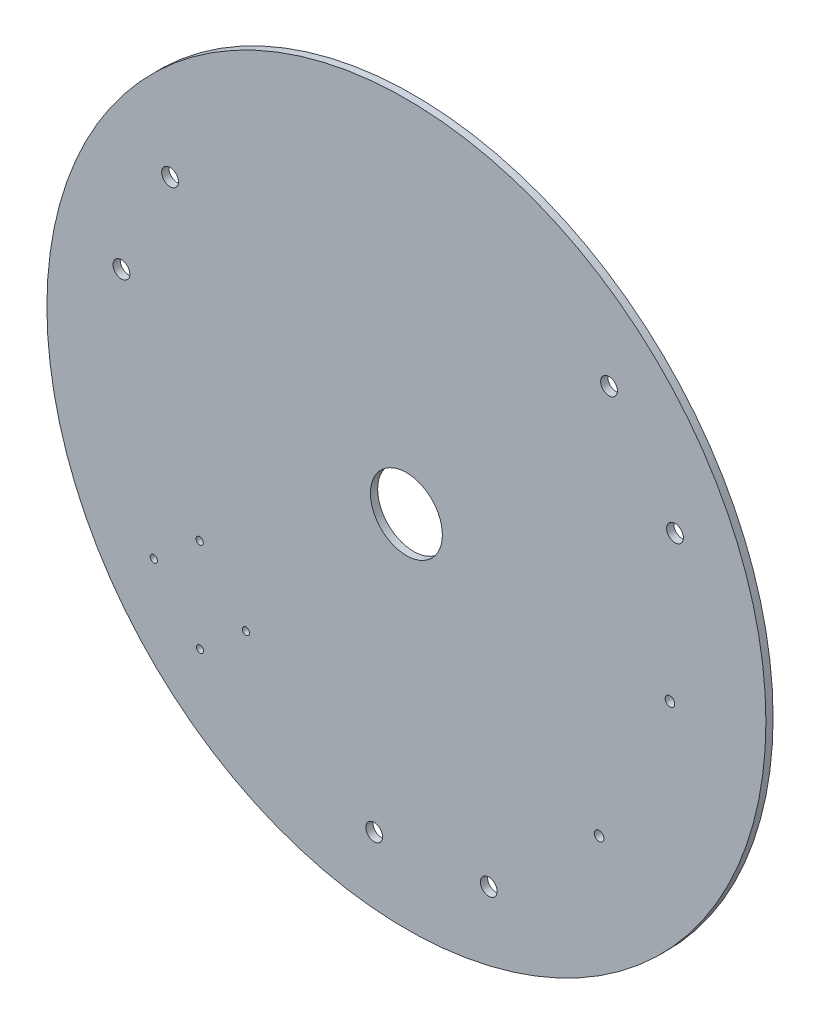
ISO-10303-21;
HEADER;
FILE_DESCRIPTION(('STEP AP214'),'2;1');
FILE_NAME('part.step','',(''),(''),'','','');
FILE_SCHEMA(('AUTOMOTIVE_DESIGN { 1 0 10303 214 1 1 1 1 }'));
ENDSEC;
DATA;
#1=APPLICATION_CONTEXT('core data for automotive mechanical design processes');
#2=APPLICATION_PROTOCOL_DEFINITION('international standard','automotive_design',2000,#1);
#3=PRODUCT_CONTEXT('',#1,'mechanical');
#4=PRODUCT('Part','Part','',(#3));
#5=PRODUCT_RELATED_PRODUCT_CATEGORY('part','',(#4));
#6=PRODUCT_DEFINITION_FORMATION('','',#4);
#7=PRODUCT_DEFINITION_CONTEXT('part definition',#1,'design');
#8=PRODUCT_DEFINITION('design','',#6,#7);
#9=PRODUCT_DEFINITION_SHAPE('','',#8);
#10=(LENGTH_UNIT() NAMED_UNIT(*) SI_UNIT(.MILLI.,.METRE.));
#11=(NAMED_UNIT(*) PLANE_ANGLE_UNIT() SI_UNIT($,.RADIAN.));
#12=(NAMED_UNIT(*) SI_UNIT($,.STERADIAN.) SOLID_ANGLE_UNIT());
#13=UNCERTAINTY_MEASURE_WITH_UNIT(LENGTH_MEASURE(1.E-05),#10,'distance_accuracy_value','');
#14=(GEOMETRIC_REPRESENTATION_CONTEXT(3) GLOBAL_UNCERTAINTY_ASSIGNED_CONTEXT((#13)) GLOBAL_UNIT_ASSIGNED_CONTEXT((#10,
#11,#12)) REPRESENTATION_CONTEXT('',''));
#15=CARTESIAN_POINT('',(0.,0.,0.));
#16=DIRECTION('',(0.,0.,1.));
#17=DIRECTION('',(1.,0.,0.));
#18=AXIS2_PLACEMENT_3D('',#15,#16,#17);
#19=CARTESIAN_POINT('',(0.,0.,3.));
#20=DIRECTION('',(0.,0.,-1.));
#21=DIRECTION('',(-1.,0.,0.));
#22=AXIS2_PLACEMENT_3D('',#19,#20,#21);
#23=CYLINDRICAL_SURFACE('',#22,150.);
#24=CARTESIAN_POINT('',(0.,0.,3.));
#25=DIRECTION('',(0.,0.,1.));
#26=DIRECTION('',(1.,0.,0.));
#27=AXIS2_PLACEMENT_3D('',#24,#25,#26);
#28=CIRCLE('',#27,150.);
#29=CARTESIAN_POINT('',(150.,0.,3.));
#30=VERTEX_POINT('',#29);
#31=EDGE_CURVE('E10',#30,#30,#28,.T.);
#32=ORIENTED_EDGE('',*,*,#31,.F.);
#33=EDGE_LOOP('',(#32));
#34=FACE_BOUND('',#33,.T.);
#35=CARTESIAN_POINT('',(0.,0.,0.));
#36=DIRECTION('',(0.,0.,1.));
#37=DIRECTION('',(1.,0.,0.));
#38=AXIS2_PLACEMENT_3D('',#35,#36,#37);
#39=CIRCLE('',#38,150.);
#40=CARTESIAN_POINT('',(150.,0.,0.));
#41=VERTEX_POINT('',#40);
#42=EDGE_CURVE('E37',#41,#41,#39,.T.);
#43=ORIENTED_EDGE('',*,*,#42,.T.);
#44=EDGE_LOOP('',(#43));
#45=FACE_BOUND('',#44,.T.);
#46=ADVANCED_FACE('F34',(#34,#45),#23,.T.);
#47=CARTESIAN_POINT('',(0.,0.,3.));
#48=DIRECTION('',(0.,0.,1.));
#49=DIRECTION('',(1.,0.,0.));
#50=AXIS2_PLACEMENT_3D('',#47,#48,#49);
#51=PLANE('',#50);
#52=CARTESIAN_POINT('',(-66.9626301666005,-75.7694276154379,3.));
#53=DIRECTION('',(0.,0.,1.));
#54=DIRECTION('',(1.,0.,0.));
#55=AXIS2_PLACEMENT_3D('',#52,#53,#54);
#56=CIRCLE('',#55,1.5);
#57=CARTESIAN_POINT('',(-65.4626301666005,-75.7694276154379,3.));
#58=VERTEX_POINT('',#57);
#59=EDGE_CURVE('E99',#58,#58,#56,.F.);
#60=ORIENTED_EDGE('',*,*,#59,.T.);
#61=EDGE_LOOP('',(#60));
#62=FACE_BOUND('',#61,.T.);
#63=CARTESIAN_POINT('',(-86.1137412445752,-91.8391178576012,3.));
#64=DIRECTION('',(0.,0.,1.));
#65=DIRECTION('',(1.,0.,0.));
#66=AXIS2_PLACEMENT_3D('',#63,#64,#65);
#67=CIRCLE('',#66,1.5);
#68=CARTESIAN_POINT('',(-84.6137412445751,-91.8391178576012,3.));
#69=VERTEX_POINT('',#68);
#70=EDGE_CURVE('E110',#69,#69,#67,.F.);
#71=ORIENTED_EDGE('',*,*,#70,.T.);
#72=EDGE_LOOP('',(#71));
#73=FACE_BOUND('',#72,.T.);
#74=CARTESIAN_POINT('',(-105.397369535171,-68.8577845640317,3.));
#75=DIRECTION('',(0.,0.,1.));
#76=DIRECTION('',(1.,0.,0.));
#77=AXIS2_PLACEMENT_3D('',#74,#75,#76);
#78=CIRCLE('',#77,1.5);
#79=CARTESIAN_POINT('',(-103.897369535171,-68.8577845640317,3.));
#80=VERTEX_POINT('',#79);
#81=EDGE_CURVE('E103',#80,#80,#78,.F.);
#82=ORIENTED_EDGE('',*,*,#81,.T.);
#83=EDGE_LOOP('',(#82));
#84=FACE_BOUND('',#83,.T.);
#85=CARTESIAN_POINT('',(-86.2462584571964,-52.7880943218684,3.));
#86=DIRECTION('',(0.,0.,1.));
#87=DIRECTION('',(1.,0.,0.));
#88=AXIS2_PLACEMENT_3D('',#85,#86,#87);
#89=CIRCLE('',#88,1.5);
#90=CARTESIAN_POINT('',(-84.7462584571964,-52.7880943218684,3.));
#91=VERTEX_POINT('',#90);
#92=EDGE_CURVE('E104',#91,#91,#89,.F.);
#93=ORIENTED_EDGE('',*,*,#92,.T.);
#94=EDGE_LOOP('',(#93));
#95=FACE_BOUND('',#94,.T.);
#96=CARTESIAN_POINT('',(0.,0.,3.));
#97=DIRECTION('',(0.,0.,1.));
#98=DIRECTION('',(1.,0.,0.));
#99=AXIS2_PLACEMENT_3D('',#96,#97,#98);
#100=CIRCLE('',#99,15.);
#101=CARTESIAN_POINT('',(15.,0.,3.));
#102=VERTEX_POINT('',#101);
#103=EDGE_CURVE('E89',#102,#102,#100,.F.);
#104=ORIENTED_EDGE('',*,*,#103,.T.);
#105=EDGE_LOOP('',(#104));
#106=FACE_BOUND('',#105,.T.);
#107=CARTESIAN_POINT('',(109.953956799773,-12.6541449364913,3.));
#108=DIRECTION('',(0.,0.,1.));
#109=DIRECTION('',(1.,0.,0.));
#110=AXIS2_PLACEMENT_3D('',#107,#108,#109);
#111=CIRCLE('',#110,2.);
#112=CARTESIAN_POINT('',(111.953956799773,-12.6541449364913,3.));
#113=VERTEX_POINT('',#112);
#114=EDGE_CURVE('E65',#113,#113,#111,.F.);
#115=ORIENTED_EDGE('',*,*,#114,.T.);
#116=EDGE_LOOP('',(#115));
#117=FACE_BOUND('',#116,.T.);
#118=CARTESIAN_POINT('',(80.3706784779234,-76.0956900290566,3.));
#119=DIRECTION('',(0.,0.,1.));
#120=DIRECTION('',(1.,0.,0.));
#121=AXIS2_PLACEMENT_3D('',#118,#119,#120);
#122=CIRCLE('',#121,2.);
#123=CARTESIAN_POINT('',(82.3706784779234,-76.0956900290566,3.));
#124=VERTEX_POINT('',#123);
#125=EDGE_CURVE('E86',#124,#124,#122,.F.);
#126=ORIENTED_EDGE('',*,*,#125,.T.);
#127=EDGE_LOOP('',(#126));
#128=FACE_BOUND('',#127,.T.);
#129=CARTESIAN_POINT('',(34.3673618839201,-117.451625945066,3.));
#130=DIRECTION('',(0.,0.,1.));
#131=DIRECTION('',(1.,0.,0.));
#132=AXIS2_PLACEMENT_3D('',#129,#130,#131);
#133=CIRCLE('',#132,3.50000000000001);
#134=CARTESIAN_POINT('',(37.8673618839201,-117.451625945066,3.));
#135=VERTEX_POINT('',#134);
#136=EDGE_CURVE('E53',#135,#135,#133,.F.);
#137=ORIENTED_EDGE('',*,*,#136,.T.);
#138=EDGE_LOOP('',(#137));
#139=FACE_BOUND('',#138,.T.);
#140=CARTESIAN_POINT('',(-13.4499836244839,-121.635101596953,3.));
#141=DIRECTION('',(0.,0.,1.));
#142=DIRECTION('',(1.,0.,0.));
#143=AXIS2_PLACEMENT_3D('',#140,#141,#142);
#144=CIRCLE('',#143,3.50000000000002);
#145=CARTESIAN_POINT('',(-9.94998362448386,-121.635101596953,3.));
#146=VERTEX_POINT('',#145);
#147=EDGE_CURVE('E72',#146,#146,#144,.F.);
#148=ORIENTED_EDGE('',*,*,#147,.T.);
#149=EDGE_LOOP('',(#148));
#150=FACE_BOUND('',#149,.T.);
#151=CARTESIAN_POINT('',(-118.899772726174,28.9628045200057,3.));
#152=DIRECTION('',(0.,0.,1.));
#153=DIRECTION('',(1.,0.,0.));
#154=AXIS2_PLACEMENT_3D('',#151,#152,#153);
#155=CIRCLE('',#154,3.50000000000001);
#156=CARTESIAN_POINT('',(-115.399772726174,28.9628045200057,3.));
#157=VERTEX_POINT('',#156);
#158=EDGE_CURVE('E66',#157,#157,#155,.F.);
#159=ORIENTED_EDGE('',*,*,#158,.T.);
#160=EDGE_LOOP('',(#159));
#161=FACE_BOUND('',#160,.T.);
#162=CARTESIAN_POINT('',(-98.6140961626203,72.4655782977648,3.));
#163=DIRECTION('',(0.,0.,1.));
#164=DIRECTION('',(1.,0.,0.));
#165=AXIS2_PLACEMENT_3D('',#162,#163,#164);
#166=CIRCLE('',#165,3.50000000000002);
#167=CARTESIAN_POINT('',(-95.1140961626203,72.4655782977648,3.));
#168=VERTEX_POINT('',#167);
#169=EDGE_CURVE('E58',#168,#168,#166,.F.);
#170=ORIENTED_EDGE('',*,*,#169,.T.);
#171=EDGE_LOOP('',(#170));
#172=FACE_BOUND('',#171,.T.);
#173=CARTESIAN_POINT('',(84.5324108422541,88.4888214250612,3.));
#174=DIRECTION('',(0.,0.,1.));
#175=DIRECTION('',(1.,0.,0.));
#176=AXIS2_PLACEMENT_3D('',#173,#174,#175);
#177=CIRCLE('',#176,3.50000000000001);
#178=CARTESIAN_POINT('',(88.0324108422541,88.4888214250612,3.));
#179=VERTEX_POINT('',#178);
#180=EDGE_CURVE('E44',#179,#179,#177,.F.);
#181=ORIENTED_EDGE('',*,*,#180,.T.);
#182=EDGE_LOOP('',(#181));
#183=FACE_BOUND('',#182,.T.);
#184=CARTESIAN_POINT('',(112.064079787104,49.1695232991894,3.));
#185=DIRECTION('',(0.,0.,1.));
#186=DIRECTION('',(1.,0.,0.));
#187=AXIS2_PLACEMENT_3D('',#184,#185,#186);
#188=CIRCLE('',#187,3.50000000000002);
#189=CARTESIAN_POINT('',(115.564079787104,49.1695232991894,3.));
#190=VERTEX_POINT('',#189);
#191=EDGE_CURVE('E50',#190,#190,#188,.F.);
#192=ORIENTED_EDGE('',*,*,#191,.T.);
#193=EDGE_LOOP('',(#192));
#194=FACE_BOUND('',#193,.T.);
#195=ORIENTED_EDGE('',*,*,#31,.T.);
#196=EDGE_LOOP('',(#195));
#197=FACE_BOUND('',#196,.T.);
#198=ADVANCED_FACE('F131',(#62,#73,#84,#95,#106,#117,#128,#139,#150,#161,#172,#183,#194,#197),
#51,.T.);
#199=CARTESIAN_POINT('',(0.,0.,0.));
#200=DIRECTION('',(0.,0.,1.));
#201=DIRECTION('',(1.,0.,0.));
#202=AXIS2_PLACEMENT_3D('',#199,#200,#201);
#203=PLANE('',#202);
#204=CARTESIAN_POINT('',(-66.9626301666005,-75.7694276154379,0.));
#205=DIRECTION('',(0.,0.,-1.));
#206=DIRECTION('',(-1.,0.,0.));
#207=AXIS2_PLACEMENT_3D('',#204,#205,#206);
#208=CIRCLE('',#207,1.5);
#209=CARTESIAN_POINT('',(-68.4626301666005,-75.7694276154379,0.));
#210=VERTEX_POINT('',#209);
#211=EDGE_CURVE('E116',#210,#210,#208,.T.);
#212=ORIENTED_EDGE('',*,*,#211,.F.);
#213=EDGE_LOOP('',(#212));
#214=FACE_BOUND('',#213,.T.);
#215=CARTESIAN_POINT('',(-86.1137412445752,-91.8391178576012,0.));
#216=DIRECTION('',(0.,0.,-1.));
#217=DIRECTION('',(-1.,0.,0.));
#218=AXIS2_PLACEMENT_3D('',#215,#216,#217);
#219=CIRCLE('',#218,1.5);
#220=CARTESIAN_POINT('',(-87.6137412445752,-91.8391178576012,0.));
#221=VERTEX_POINT('',#220);
#222=EDGE_CURVE('E113',#221,#221,#219,.T.);
#223=ORIENTED_EDGE('',*,*,#222,.F.);
#224=EDGE_LOOP('',(#223));
#225=FACE_BOUND('',#224,.T.);
#226=CARTESIAN_POINT('',(-105.397369535171,-68.8577845640317,0.));
#227=DIRECTION('',(0.,0.,-1.));
#228=DIRECTION('',(-1.,0.,0.));
#229=AXIS2_PLACEMENT_3D('',#226,#227,#228);
#230=CIRCLE('',#229,1.5);
#231=CARTESIAN_POINT('',(-106.897369535171,-68.8577845640317,0.));
#232=VERTEX_POINT('',#231);
#233=EDGE_CURVE('E107',#232,#232,#230,.T.);
#234=ORIENTED_EDGE('',*,*,#233,.F.);
#235=EDGE_LOOP('',(#234));
#236=FACE_BOUND('',#235,.T.);
#237=CARTESIAN_POINT('',(-86.2462584571964,-52.7880943218684,0.));
#238=DIRECTION('',(0.,0.,-1.));
#239=DIRECTION('',(-1.,0.,0.));
#240=AXIS2_PLACEMENT_3D('',#237,#238,#239);
#241=CIRCLE('',#240,1.5);
#242=CARTESIAN_POINT('',(-87.7462584571965,-52.7880943218684,0.));
#243=VERTEX_POINT('',#242);
#244=EDGE_CURVE('E100',#243,#243,#241,.T.);
#245=ORIENTED_EDGE('',*,*,#244,.F.);
#246=EDGE_LOOP('',(#245));
#247=FACE_BOUND('',#246,.T.);
#248=CARTESIAN_POINT('',(0.,0.,0.));
#249=DIRECTION('',(0.,0.,-1.));
#250=DIRECTION('',(-1.,0.,0.));
#251=AXIS2_PLACEMENT_3D('',#248,#249,#250);
#252=CIRCLE('',#251,15.);
#253=CARTESIAN_POINT('',(-15.,0.,0.));
#254=VERTEX_POINT('',#253);
#255=EDGE_CURVE('E96',#254,#254,#252,.T.);
#256=ORIENTED_EDGE('',*,*,#255,.F.);
#257=EDGE_LOOP('',(#256));
#258=FACE_BOUND('',#257,.T.);
#259=CARTESIAN_POINT('',(109.953956799773,-12.6541449364913,0.));
#260=DIRECTION('',(0.,0.,-1.));
#261=DIRECTION('',(-1.,0.,0.));
#262=AXIS2_PLACEMENT_3D('',#259,#260,#261);
#263=CIRCLE('',#262,2.);
#264=CARTESIAN_POINT('',(107.953956799773,-12.6541449364913,0.));
#265=VERTEX_POINT('',#264);
#266=EDGE_CURVE('E85',#265,#265,#263,.T.);
#267=ORIENTED_EDGE('',*,*,#266,.F.);
#268=EDGE_LOOP('',(#267));
#269=FACE_BOUND('',#268,.T.);
#270=CARTESIAN_POINT('',(80.3706784779234,-76.0956900290566,0.));
#271=DIRECTION('',(0.,0.,-1.));
#272=DIRECTION('',(-1.,0.,0.));
#273=AXIS2_PLACEMENT_3D('',#270,#271,#272);
#274=CIRCLE('',#273,2.);
#275=CARTESIAN_POINT('',(78.3706784779234,-76.0956900290566,0.));
#276=VERTEX_POINT('',#275);
#277=EDGE_CURVE('E82',#276,#276,#274,.T.);
#278=ORIENTED_EDGE('',*,*,#277,.F.);
#279=EDGE_LOOP('',(#278));
#280=FACE_BOUND('',#279,.T.);
#281=CARTESIAN_POINT('',(34.3673618839201,-117.451625945066,0.));
#282=DIRECTION('',(0.,0.,-1.));
#283=DIRECTION('',(0.500000000000004,0.866025403784436,0.));
#284=AXIS2_PLACEMENT_3D('',#281,#282,#283);
#285=CIRCLE('',#284,3.50000000000001);
#286=CARTESIAN_POINT('',(36.1173618839201,-114.42053703182,0.));
#287=VERTEX_POINT('',#286);
#288=EDGE_CURVE('E75',#287,#287,#285,.T.);
#289=ORIENTED_EDGE('',*,*,#288,.F.);
#290=EDGE_LOOP('',(#289));
#291=FACE_BOUND('',#290,.T.);
#292=CARTESIAN_POINT('',(-13.4499836244839,-121.635101596953,0.));
#293=DIRECTION('',(0.,0.,-1.));
#294=DIRECTION('',(-0.500000000000004,-0.866025403784436,0.));
#295=AXIS2_PLACEMENT_3D('',#292,#293,#294);
#296=CIRCLE('',#295,3.50000000000002);
#297=CARTESIAN_POINT('',(-15.1999836244839,-124.666190510199,0.));
#298=VERTEX_POINT('',#297);
#299=EDGE_CURVE('E69',#298,#298,#296,.T.);
#300=ORIENTED_EDGE('',*,*,#299,.F.);
#301=EDGE_LOOP('',(#300));
#302=FACE_BOUND('',#301,.T.);
#303=CARTESIAN_POINT('',(-118.899772726174,28.9628045200057,0.));
#304=DIRECTION('',(0.,0.,-1.));
#305=DIRECTION('',(0.499999999999992,-0.866025403784443,0.));
#306=AXIS2_PLACEMENT_3D('',#303,#304,#305);
#307=CIRCLE('',#306,3.50000000000001);
#308=CARTESIAN_POINT('',(-117.149772726174,25.9317156067601,0.));
#309=VERTEX_POINT('',#308);
#310=EDGE_CURVE('E61',#309,#309,#307,.T.);
#311=ORIENTED_EDGE('',*,*,#310,.F.);
#312=EDGE_LOOP('',(#311));
#313=FACE_BOUND('',#312,.T.);
#314=CARTESIAN_POINT('',(-98.6140961626203,72.4655782977648,0.));
#315=DIRECTION('',(0.,0.,-1.));
#316=DIRECTION('',(-0.499999999999992,0.866025403784443,0.));
#317=AXIS2_PLACEMENT_3D('',#314,#315,#316);
#318=CIRCLE('',#317,3.50000000000002);
#319=CARTESIAN_POINT('',(-100.36409616262,75.4966672110103,0.));
#320=VERTEX_POINT('',#319);
#321=EDGE_CURVE('E62',#320,#320,#318,.T.);
#322=ORIENTED_EDGE('',*,*,#321,.F.);
#323=EDGE_LOOP('',(#322));
#324=FACE_BOUND('',#323,.T.);
#325=CARTESIAN_POINT('',(84.5324108422541,88.4888214250612,0.));
#326=DIRECTION('',(0.,0.,-1.));
#327=DIRECTION('',(-1.,0.,0.));
#328=AXIS2_PLACEMENT_3D('',#325,#326,#327);
#329=CIRCLE('',#328,3.50000000000001);
#330=CARTESIAN_POINT('',(81.0324108422541,88.4888214250612,0.));
#331=VERTEX_POINT('',#330);
#332=EDGE_CURVE('E49',#331,#331,#329,.T.);
#333=ORIENTED_EDGE('',*,*,#332,.F.);
#334=EDGE_LOOP('',(#333));
#335=FACE_BOUND('',#334,.T.);
#336=CARTESIAN_POINT('',(112.064079787104,49.1695232991894,0.));
#337=DIRECTION('',(0.,0.,-1.));
#338=DIRECTION('',(1.,0.,0.));
#339=AXIS2_PLACEMENT_3D('',#336,#337,#338);
#340=CIRCLE('',#339,3.50000000000002);
#341=CARTESIAN_POINT('',(115.564079787104,49.1695232991894,0.));
#342=VERTEX_POINT('',#341);
#343=EDGE_CURVE('E46',#342,#342,#340,.T.);
#344=ORIENTED_EDGE('',*,*,#343,.F.);
#345=EDGE_LOOP('',(#344));
#346=FACE_BOUND('',#345,.T.);
#347=ORIENTED_EDGE('',*,*,#42,.F.);
#348=EDGE_LOOP('',(#347));
#349=FACE_BOUND('',#348,.T.);
#350=ADVANCED_FACE('F127',(#214,#225,#236,#247,#258,#269,#280,#291,#302,#313,#324,#335,#346,
#349),#203,.F.);
#351=CARTESIAN_POINT('',(112.064079787104,49.1695232991894,12.8994949366117));
#352=DIRECTION('',(0.,0.,-1.));
#353=DIRECTION('',(-1.,0.,0.));
#354=AXIS2_PLACEMENT_3D('',#351,#352,#353);
#355=CYLINDRICAL_SURFACE('',#354,3.50000000000002);
#356=ORIENTED_EDGE('',*,*,#343,.T.);
#357=EDGE_LOOP('',(#356));
#358=FACE_BOUND('',#357,.T.);
#359=ORIENTED_EDGE('',*,*,#191,.F.);
#360=EDGE_LOOP('',(#359));
#361=FACE_BOUND('',#360,.T.);
#362=ADVANCED_FACE('F130',(#358,#361),#355,.F.);
#363=CARTESIAN_POINT('',(84.5324108422541,88.4888214250612,12.8994949366117));
#364=DIRECTION('',(0.,0.,-1.));
#365=DIRECTION('',(-1.,0.,0.));
#366=AXIS2_PLACEMENT_3D('',#363,#364,#365);
#367=CYLINDRICAL_SURFACE('',#366,3.50000000000001);
#368=ORIENTED_EDGE('',*,*,#332,.T.);
#369=EDGE_LOOP('',(#368));
#370=FACE_BOUND('',#369,.T.);
#371=ORIENTED_EDGE('',*,*,#180,.F.);
#372=EDGE_LOOP('',(#371));
#373=FACE_BOUND('',#372,.T.);
#374=ADVANCED_FACE('F172',(#370,#373),#367,.F.);
#375=CARTESIAN_POINT('',(-98.6140961626203,72.4655782977648,12.8994949366117));
#376=DIRECTION('',(0.,0.,-1.));
#377=DIRECTION('',(-1.,0.,0.));
#378=AXIS2_PLACEMENT_3D('',#375,#376,#377);
#379=CYLINDRICAL_SURFACE('',#378,3.50000000000002);
#380=ORIENTED_EDGE('',*,*,#321,.T.);
#381=EDGE_LOOP('',(#380));
#382=FACE_BOUND('',#381,.T.);
#383=ORIENTED_EDGE('',*,*,#169,.F.);
#384=EDGE_LOOP('',(#383));
#385=FACE_BOUND('',#384,.T.);
#386=ADVANCED_FACE('F176',(#382,#385),#379,.F.);
#387=CARTESIAN_POINT('',(-118.899772726174,28.9628045200057,12.8994949366117));
#388=DIRECTION('',(0.,0.,-1.));
#389=DIRECTION('',(-1.,0.,0.));
#390=AXIS2_PLACEMENT_3D('',#387,#388,#389);
#391=CYLINDRICAL_SURFACE('',#390,3.50000000000001);
#392=ORIENTED_EDGE('',*,*,#310,.T.);
#393=EDGE_LOOP('',(#392));
#394=FACE_BOUND('',#393,.T.);
#395=ORIENTED_EDGE('',*,*,#158,.F.);
#396=EDGE_LOOP('',(#395));
#397=FACE_BOUND('',#396,.T.);
#398=ADVANCED_FACE('F180',(#394,#397),#391,.F.);
#399=CARTESIAN_POINT('',(-13.4499836244839,-121.635101596953,12.8994949366117));
#400=DIRECTION('',(0.,0.,-1.));
#401=DIRECTION('',(-1.,0.,0.));
#402=AXIS2_PLACEMENT_3D('',#399,#400,#401);
#403=CYLINDRICAL_SURFACE('',#402,3.50000000000002);
#404=ORIENTED_EDGE('',*,*,#299,.T.);
#405=EDGE_LOOP('',(#404));
#406=FACE_BOUND('',#405,.T.);
#407=ORIENTED_EDGE('',*,*,#147,.F.);
#408=EDGE_LOOP('',(#407));
#409=FACE_BOUND('',#408,.T.);
#410=ADVANCED_FACE('F184',(#406,#409),#403,.F.);
#411=CARTESIAN_POINT('',(34.3673618839201,-117.451625945066,12.8994949366117));
#412=DIRECTION('',(0.,0.,-1.));
#413=DIRECTION('',(-1.,0.,0.));
#414=AXIS2_PLACEMENT_3D('',#411,#412,#413);
#415=CYLINDRICAL_SURFACE('',#414,3.50000000000001);
#416=ORIENTED_EDGE('',*,*,#288,.T.);
#417=EDGE_LOOP('',(#416));
#418=FACE_BOUND('',#417,.T.);
#419=ORIENTED_EDGE('',*,*,#136,.F.);
#420=EDGE_LOOP('',(#419));
#421=FACE_BOUND('',#420,.T.);
#422=ADVANCED_FACE('F188',(#418,#421),#415,.F.);
#423=CARTESIAN_POINT('',(80.3706784779234,-76.0956900290566,8.65685424949239));
#424=DIRECTION('',(0.,0.,-1.));
#425=DIRECTION('',(-1.,0.,0.));
#426=AXIS2_PLACEMENT_3D('',#423,#424,#425);
#427=CYLINDRICAL_SURFACE('',#426,2.);
#428=ORIENTED_EDGE('',*,*,#277,.T.);
#429=EDGE_LOOP('',(#428));
#430=FACE_BOUND('',#429,.T.);
#431=ORIENTED_EDGE('',*,*,#125,.F.);
#432=EDGE_LOOP('',(#431));
#433=FACE_BOUND('',#432,.T.);
#434=ADVANCED_FACE('F192',(#430,#433),#427,.F.);
#435=CARTESIAN_POINT('',(109.953956799773,-12.6541449364913,8.65685424949239));
#436=DIRECTION('',(0.,0.,-1.));
#437=DIRECTION('',(-1.,0.,0.));
#438=AXIS2_PLACEMENT_3D('',#435,#436,#437);
#439=CYLINDRICAL_SURFACE('',#438,2.);
#440=ORIENTED_EDGE('',*,*,#266,.T.);
#441=EDGE_LOOP('',(#440));
#442=FACE_BOUND('',#441,.T.);
#443=ORIENTED_EDGE('',*,*,#114,.F.);
#444=EDGE_LOOP('',(#443));
#445=FACE_BOUND('',#444,.T.);
#446=ADVANCED_FACE('F196',(#442,#445),#439,.F.);
#447=CARTESIAN_POINT('',(0.,0.,45.4264068711929));
#448=DIRECTION('',(0.,0.,-1.));
#449=DIRECTION('',(-1.,0.,0.));
#450=AXIS2_PLACEMENT_3D('',#447,#448,#449);
#451=CYLINDRICAL_SURFACE('',#450,15.);
#452=ORIENTED_EDGE('',*,*,#255,.T.);
#453=EDGE_LOOP('',(#452));
#454=FACE_BOUND('',#453,.T.);
#455=ORIENTED_EDGE('',*,*,#103,.F.);
#456=EDGE_LOOP('',(#455));
#457=FACE_BOUND('',#456,.T.);
#458=ADVANCED_FACE('F200',(#454,#457),#451,.F.);
#459=CARTESIAN_POINT('',(-86.2462584571964,-52.7880943218684,7.24264068711929));
#460=DIRECTION('',(0.,0.,-1.));
#461=DIRECTION('',(-1.,0.,0.));
#462=AXIS2_PLACEMENT_3D('',#459,#460,#461);
#463=CYLINDRICAL_SURFACE('',#462,1.5);
#464=ORIENTED_EDGE('',*,*,#244,.T.);
#465=EDGE_LOOP('',(#464));
#466=FACE_BOUND('',#465,.T.);
#467=ORIENTED_EDGE('',*,*,#92,.F.);
#468=EDGE_LOOP('',(#467));
#469=FACE_BOUND('',#468,.T.);
#470=ADVANCED_FACE('F204',(#466,#469),#463,.F.);
#471=CARTESIAN_POINT('',(-105.397369535171,-68.8577845640317,7.24264068711929));
#472=DIRECTION('',(0.,0.,-1.));
#473=DIRECTION('',(-1.,0.,0.));
#474=AXIS2_PLACEMENT_3D('',#471,#472,#473);
#475=CYLINDRICAL_SURFACE('',#474,1.5);
#476=ORIENTED_EDGE('',*,*,#233,.T.);
#477=EDGE_LOOP('',(#476));
#478=FACE_BOUND('',#477,.T.);
#479=ORIENTED_EDGE('',*,*,#81,.F.);
#480=EDGE_LOOP('',(#479));
#481=FACE_BOUND('',#480,.T.);
#482=ADVANCED_FACE('F208',(#478,#481),#475,.F.);
#483=CARTESIAN_POINT('',(-86.1137412445752,-91.8391178576012,7.24264068711929));
#484=DIRECTION('',(0.,0.,-1.));
#485=DIRECTION('',(-1.,0.,0.));
#486=AXIS2_PLACEMENT_3D('',#483,#484,#485);
#487=CYLINDRICAL_SURFACE('',#486,1.5);
#488=ORIENTED_EDGE('',*,*,#222,.T.);
#489=EDGE_LOOP('',(#488));
#490=FACE_BOUND('',#489,.T.);
#491=ORIENTED_EDGE('',*,*,#70,.F.);
#492=EDGE_LOOP('',(#491));
#493=FACE_BOUND('',#492,.T.);
#494=ADVANCED_FACE('F212',(#490,#493),#487,.F.);
#495=CARTESIAN_POINT('',(-66.9626301666005,-75.7694276154379,7.24264068711929));
#496=DIRECTION('',(0.,0.,-1.));
#497=DIRECTION('',(-1.,0.,0.));
#498=AXIS2_PLACEMENT_3D('',#495,#496,#497);
#499=CYLINDRICAL_SURFACE('',#498,1.5);
#500=ORIENTED_EDGE('',*,*,#211,.T.);
#501=EDGE_LOOP('',(#500));
#502=FACE_BOUND('',#501,.T.);
#503=ORIENTED_EDGE('',*,*,#59,.F.);
#504=EDGE_LOOP('',(#503));
#505=FACE_BOUND('',#504,.T.);
#506=ADVANCED_FACE('F124',(#502,#505),#499,.F.);
#507=CLOSED_SHELL('',(#46,#198,#350,#362,#374,#386,#398,#410,#422,#434,#446,#458,#470,#482,#494,#506));
#508=MANIFOLD_SOLID_BREP('B2',#507);
#509=ADVANCED_BREP_SHAPE_REPRESENTATION('',(#18,#508),#14);
#510=SHAPE_DEFINITION_REPRESENTATION(#9,#509);
ENDSEC;
END-ISO-10303-21;
